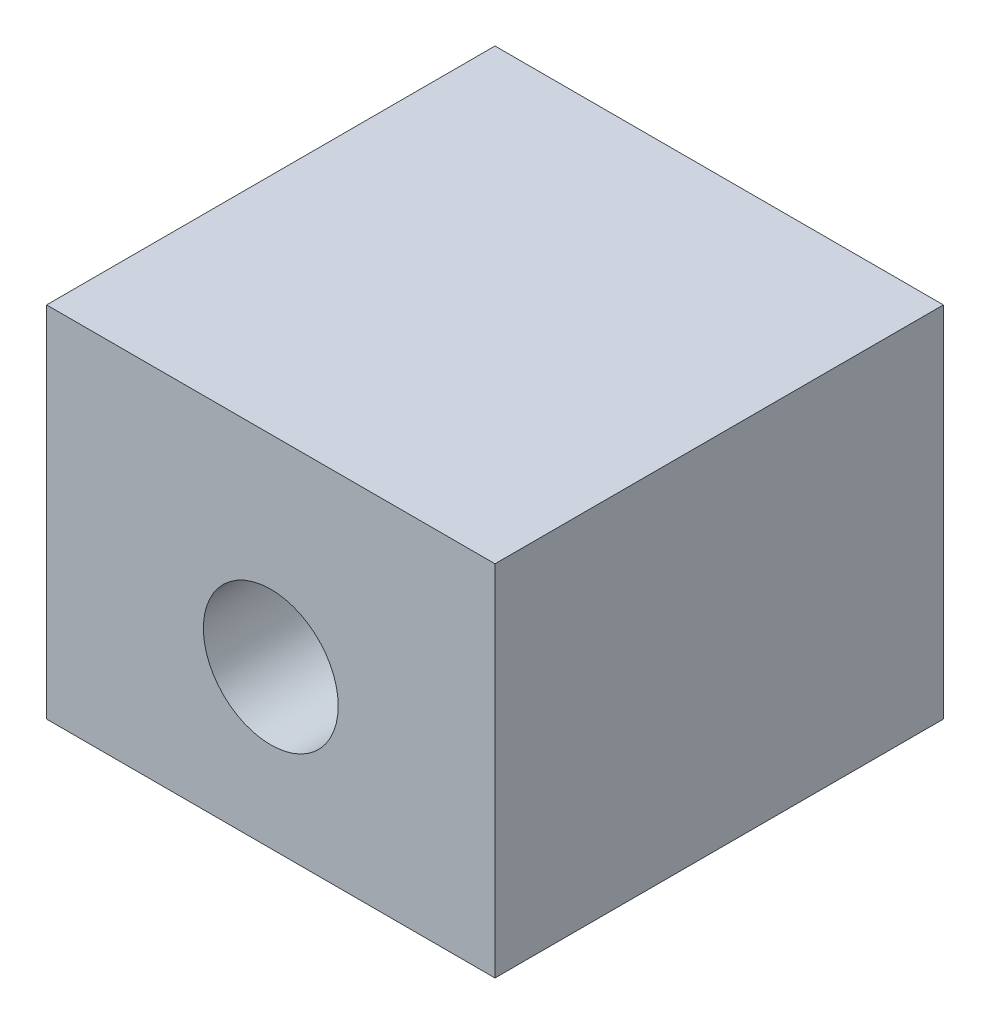
ISO-10303-21;
HEADER;
FILE_DESCRIPTION(('STEP AP214'),'2;1');
FILE_NAME('part.step','',(''),(''),'','','');
FILE_SCHEMA(('AUTOMOTIVE_DESIGN { 1 0 10303 214 1 1 1 1 }'));
ENDSEC;
DATA;
#1=APPLICATION_CONTEXT('core data for automotive mechanical design processes');
#2=APPLICATION_PROTOCOL_DEFINITION('international standard','automotive_design',2000,#1);
#3=PRODUCT_CONTEXT('',#1,'mechanical');
#4=PRODUCT('Part','Part','',(#3));
#5=PRODUCT_RELATED_PRODUCT_CATEGORY('part','',(#4));
#6=PRODUCT_DEFINITION_FORMATION('','',#4);
#7=PRODUCT_DEFINITION_CONTEXT('part definition',#1,'design');
#8=PRODUCT_DEFINITION('design','',#6,#7);
#9=PRODUCT_DEFINITION_SHAPE('','',#8);
#10=(LENGTH_UNIT() NAMED_UNIT(*) SI_UNIT(.MILLI.,.METRE.));
#11=(NAMED_UNIT(*) PLANE_ANGLE_UNIT() SI_UNIT($,.RADIAN.));
#12=(NAMED_UNIT(*) SI_UNIT($,.STERADIAN.) SOLID_ANGLE_UNIT());
#13=UNCERTAINTY_MEASURE_WITH_UNIT(LENGTH_MEASURE(1.E-05),#10,'distance_accuracy_value','');
#14=(GEOMETRIC_REPRESENTATION_CONTEXT(3) GLOBAL_UNCERTAINTY_ASSIGNED_CONTEXT((#13)) GLOBAL_UNIT_ASSIGNED_CONTEXT((#10,
#11,#12)) REPRESENTATION_CONTEXT('',''));
#15=CARTESIAN_POINT('',(0.,0.,0.));
#16=DIRECTION('',(0.,0.,1.));
#17=DIRECTION('',(1.,0.,0.));
#18=AXIS2_PLACEMENT_3D('',#15,#16,#17);
#19=CARTESIAN_POINT('',(4.99999999999999,8.,-5.));
#20=DIRECTION('',(-1.,0.,0.));
#21=DIRECTION('',(0.,0.,1.));
#22=AXIS2_PLACEMENT_3D('',#19,#20,#21);
#23=PLANE('',#22);
#24=DIRECTION('',(0.,0.,-1.));
#25=VECTOR('',#24,1.);
#26=CARTESIAN_POINT('',(4.99999999999999,0.,-5.));
#27=LINE('',#26,#25);
#28=CARTESIAN_POINT('',(4.99999999999999,0.,5.));
#29=VERTEX_POINT('',#28);
#30=CARTESIAN_POINT('',(4.99999999999999,0.,-5.));
#31=VERTEX_POINT('',#30);
#32=EDGE_CURVE('E99',#29,#31,#27,.T.);
#33=ORIENTED_EDGE('',*,*,#32,.T.);
#34=DIRECTION('',(0.,-1.,0.));
#35=VECTOR('',#34,1.);
#36=CARTESIAN_POINT('',(4.99999999999999,8.,-5.));
#37=LINE('',#36,#35);
#38=CARTESIAN_POINT('',(4.99999999999999,8.,-5.));
#39=VERTEX_POINT('',#38);
#40=EDGE_CURVE('E11',#39,#31,#37,.T.);
#41=ORIENTED_EDGE('',*,*,#40,.F.);
#42=DIRECTION('',(0.,0.,-1.));
#43=VECTOR('',#42,1.);
#44=CARTESIAN_POINT('',(4.99999999999999,8.,-5.));
#45=LINE('',#44,#43);
#46=CARTESIAN_POINT('',(4.99999999999999,8.,5.));
#47=VERTEX_POINT('',#46);
#48=EDGE_CURVE('E87',#47,#39,#45,.T.);
#49=ORIENTED_EDGE('',*,*,#48,.F.);
#50=DIRECTION('',(0.,-1.,0.));
#51=VECTOR('',#50,1.);
#52=CARTESIAN_POINT('',(4.99999999999999,8.,5.));
#53=LINE('',#52,#51);
#54=EDGE_CURVE('E95',#47,#29,#53,.T.);
#55=ORIENTED_EDGE('',*,*,#54,.T.);
#56=EDGE_LOOP('',(#33,#41,#49,#55));
#57=FACE_BOUND('',#56,.T.);
#58=ADVANCED_FACE('F36',(#57),#23,.F.);
#59=CARTESIAN_POINT('',(-5.00000000000001,8.,-5.));
#60=DIRECTION('',(0.,0.,1.));
#61=DIRECTION('',(1.,0.,0.));
#62=AXIS2_PLACEMENT_3D('',#59,#60,#61);
#63=PLANE('',#62);
#64=CARTESIAN_POINT('',(0.,3.50543830592947,-5.));
#65=DIRECTION('',(0.,0.,1.));
#66=DIRECTION('',(1.,0.,0.));
#67=AXIS2_PLACEMENT_3D('',#64,#65,#66);
#68=CIRCLE('',#67,1.50333973755853);
#69=CARTESIAN_POINT('',(1.50333973755853,3.50543830592947,-5.));
#70=VERTEX_POINT('',#69);
#71=EDGE_CURVE('E102',#70,#70,#68,.T.);
#72=ORIENTED_EDGE('',*,*,#71,.T.);
#73=EDGE_LOOP('',(#72));
#74=FACE_BOUND('',#73,.T.);
#75=DIRECTION('',(-1.,0.,0.));
#76=VECTOR('',#75,1.);
#77=CARTESIAN_POINT('',(-5.00000000000001,0.,-5.));
#78=LINE('',#77,#76);
#79=CARTESIAN_POINT('',(-5.00000000000001,0.,-5.));
#80=VERTEX_POINT('',#79);
#81=EDGE_CURVE('E91',#31,#80,#78,.T.);
#82=ORIENTED_EDGE('',*,*,#81,.T.);
#83=DIRECTION('',(0.,-1.,0.));
#84=VECTOR('',#83,1.);
#85=CARTESIAN_POINT('',(-5.00000000000001,8.,-5.));
#86=LINE('',#85,#84);
#87=CARTESIAN_POINT('',(-5.00000000000001,8.,-5.));
#88=VERTEX_POINT('',#87);
#89=EDGE_CURVE('E44',#88,#80,#86,.T.);
#90=ORIENTED_EDGE('',*,*,#89,.F.);
#91=DIRECTION('',(-1.,0.,0.));
#92=VECTOR('',#91,1.);
#93=CARTESIAN_POINT('',(-5.00000000000001,8.,-5.));
#94=LINE('',#93,#92);
#95=EDGE_CURVE('E82',#39,#88,#94,.T.);
#96=ORIENTED_EDGE('',*,*,#95,.F.);
#97=ORIENTED_EDGE('',*,*,#40,.T.);
#98=EDGE_LOOP('',(#82,#90,#96,#97));
#99=FACE_BOUND('',#98,.T.);
#100=ADVANCED_FACE('F90',(#74,#99),#63,.F.);
#101=CARTESIAN_POINT('',(-5.00000000000001,8.,-5.));
#102=DIRECTION('',(1.,0.,0.));
#103=DIRECTION('',(0.,0.,-1.));
#104=AXIS2_PLACEMENT_3D('',#101,#102,#103);
#105=PLANE('',#104);
#106=DIRECTION('',(0.,0.,1.));
#107=VECTOR('',#106,1.);
#108=CARTESIAN_POINT('',(-5.00000000000001,0.,-5.));
#109=LINE('',#108,#107);
#110=CARTESIAN_POINT('',(-5.00000000000001,0.,5.));
#111=VERTEX_POINT('',#110);
#112=EDGE_CURVE('E69',#80,#111,#109,.T.);
#113=ORIENTED_EDGE('',*,*,#112,.T.);
#114=DIRECTION('',(0.,-1.,0.));
#115=VECTOR('',#114,1.);
#116=CARTESIAN_POINT('',(-5.00000000000001,8.,5.));
#117=LINE('',#116,#115);
#118=CARTESIAN_POINT('',(-5.00000000000001,8.,5.));
#119=VERTEX_POINT('',#118);
#120=EDGE_CURVE('E92',#119,#111,#117,.T.);
#121=ORIENTED_EDGE('',*,*,#120,.F.);
#122=DIRECTION('',(0.,0.,1.));
#123=VECTOR('',#122,1.);
#124=CARTESIAN_POINT('',(-5.00000000000001,8.,-5.));
#125=LINE('',#124,#123);
#126=EDGE_CURVE('E85',#88,#119,#125,.T.);
#127=ORIENTED_EDGE('',*,*,#126,.F.);
#128=ORIENTED_EDGE('',*,*,#89,.T.);
#129=EDGE_LOOP('',(#113,#121,#127,#128));
#130=FACE_BOUND('',#129,.T.);
#131=ADVANCED_FACE('F93',(#130),#105,.F.);
#132=CARTESIAN_POINT('',(-5.00000000000001,8.,5.));
#133=DIRECTION('',(0.,0.,-1.));
#134=DIRECTION('',(-1.,0.,0.));
#135=AXIS2_PLACEMENT_3D('',#132,#133,#134);
#136=PLANE('',#135);
#137=CARTESIAN_POINT('',(0.,3.50543830592947,5.));
#138=DIRECTION('',(0.,0.,1.));
#139=DIRECTION('',(1.,0.,0.));
#140=AXIS2_PLACEMENT_3D('',#137,#138,#139);
#141=CIRCLE('',#140,1.50333973755853);
#142=CARTESIAN_POINT('',(1.50333973755853,3.50543830592947,5.));
#143=VERTEX_POINT('',#142);
#144=EDGE_CURVE('E113',#143,#143,#141,.T.);
#145=ORIENTED_EDGE('',*,*,#144,.F.);
#146=EDGE_LOOP('',(#145));
#147=FACE_BOUND('',#146,.T.);
#148=DIRECTION('',(1.,0.,0.));
#149=VECTOR('',#148,1.);
#150=CARTESIAN_POINT('',(-5.00000000000001,0.,5.));
#151=LINE('',#150,#149);
#152=EDGE_CURVE('E75',#111,#29,#151,.T.);
#153=ORIENTED_EDGE('',*,*,#152,.T.);
#154=ORIENTED_EDGE('',*,*,#54,.F.);
#155=DIRECTION('',(1.,0.,0.));
#156=VECTOR('',#155,1.);
#157=CARTESIAN_POINT('',(-5.00000000000001,8.,5.));
#158=LINE('',#157,#156);
#159=EDGE_CURVE('E52',#119,#47,#158,.T.);
#160=ORIENTED_EDGE('',*,*,#159,.F.);
#161=ORIENTED_EDGE('',*,*,#120,.T.);
#162=EDGE_LOOP('',(#153,#154,#160,#161));
#163=FACE_BOUND('',#162,.T.);
#164=ADVANCED_FACE('F107',(#147,#163),#136,.F.);
#165=CARTESIAN_POINT('',(0.,8.,0.));
#166=DIRECTION('',(0.,1.,0.));
#167=DIRECTION('',(0.,0.,1.));
#168=AXIS2_PLACEMENT_3D('',#165,#166,#167);
#169=PLANE('',#168);
#170=ORIENTED_EDGE('',*,*,#48,.T.);
#171=ORIENTED_EDGE('',*,*,#95,.T.);
#172=ORIENTED_EDGE('',*,*,#126,.T.);
#173=ORIENTED_EDGE('',*,*,#159,.T.);
#174=EDGE_LOOP('',(#170,#171,#172,#173));
#175=FACE_BOUND('',#174,.T.);
#176=ADVANCED_FACE('F83',(#175),#169,.T.);
#177=CARTESIAN_POINT('',(0.,0.,0.));
#178=DIRECTION('',(0.,1.,0.));
#179=DIRECTION('',(0.,0.,1.));
#180=AXIS2_PLACEMENT_3D('',#177,#178,#179);
#181=PLANE('',#180);
#182=ORIENTED_EDGE('',*,*,#32,.F.);
#183=ORIENTED_EDGE('',*,*,#152,.F.);
#184=ORIENTED_EDGE('',*,*,#112,.F.);
#185=ORIENTED_EDGE('',*,*,#81,.F.);
#186=EDGE_LOOP('',(#182,#183,#184,#185));
#187=FACE_BOUND('',#186,.T.);
#188=ADVANCED_FACE('F110',(#187),#181,.F.);
#189=CARTESIAN_POINT('',(0.,3.50543830592947,-5.));
#190=DIRECTION('',(0.,0.,1.));
#191=DIRECTION('',(1.,0.,0.));
#192=AXIS2_PLACEMENT_3D('',#189,#190,#191);
#193=CYLINDRICAL_SURFACE('',#192,1.50333973755853);
#194=ORIENTED_EDGE('',*,*,#71,.F.);
#195=EDGE_LOOP('',(#194));
#196=FACE_BOUND('',#195,.T.);
#197=ORIENTED_EDGE('',*,*,#144,.T.);
#198=EDGE_LOOP('',(#197));
#199=FACE_BOUND('',#198,.T.);
#200=ADVANCED_FACE('F120',(#196,#199),#193,.F.);
#201=CLOSED_SHELL('',(#58,#100,#131,#164,#176,#188,#200));
#202=MANIFOLD_SOLID_BREP('B2',#201);
#203=ADVANCED_BREP_SHAPE_REPRESENTATION('',(#18,#202),#14);
#204=SHAPE_DEFINITION_REPRESENTATION(#9,#203);
ENDSEC;
END-ISO-10303-21;
